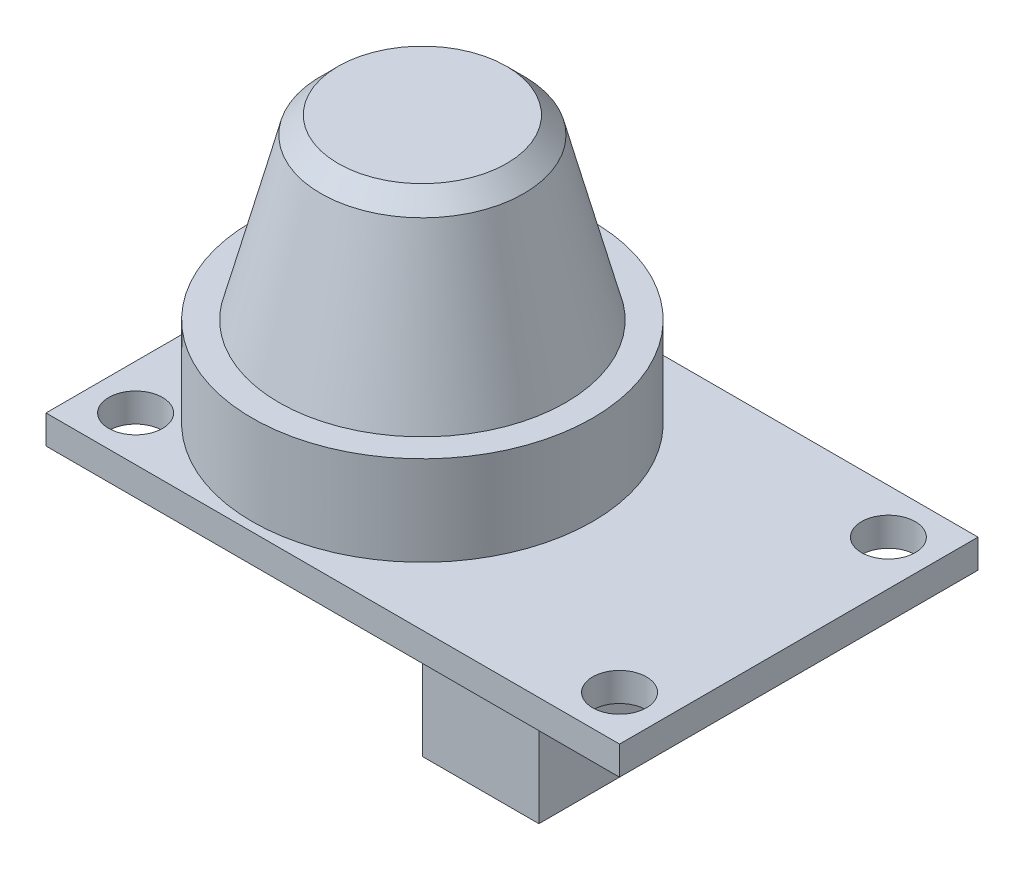
ISO-10303-21;
HEADER;
FILE_DESCRIPTION(('STEP AP214'),'2;1');
FILE_NAME('part.step','',(''),(''),'','','');
FILE_SCHEMA(('AUTOMOTIVE_DESIGN { 1 0 10303 214 1 1 1 1 }'));
ENDSEC;
DATA;
#1=APPLICATION_CONTEXT('core data for automotive mechanical design processes');
#2=APPLICATION_PROTOCOL_DEFINITION('international standard','automotive_design',2000,#1);
#3=PRODUCT_CONTEXT('',#1,'mechanical');
#4=PRODUCT('Part','Part','',(#3));
#5=PRODUCT_RELATED_PRODUCT_CATEGORY('part','',(#4));
#6=PRODUCT_DEFINITION_FORMATION('','',#4);
#7=PRODUCT_DEFINITION_CONTEXT('part definition',#1,'design');
#8=PRODUCT_DEFINITION('design','',#6,#7);
#9=PRODUCT_DEFINITION_SHAPE('','',#8);
#10=(LENGTH_UNIT() NAMED_UNIT(*) SI_UNIT(.MILLI.,.METRE.));
#11=(NAMED_UNIT(*) PLANE_ANGLE_UNIT() SI_UNIT($,.RADIAN.));
#12=(NAMED_UNIT(*) SI_UNIT($,.STERADIAN.) SOLID_ANGLE_UNIT());
#13=UNCERTAINTY_MEASURE_WITH_UNIT(LENGTH_MEASURE(1.E-05),#10,'distance_accuracy_value','');
#14=(GEOMETRIC_REPRESENTATION_CONTEXT(3) GLOBAL_UNCERTAINTY_ASSIGNED_CONTEXT((#13)) GLOBAL_UNIT_ASSIGNED_CONTEXT((#10,
#11,#12)) REPRESENTATION_CONTEXT('',''));
#15=CARTESIAN_POINT('',(0.,0.,0.));
#16=DIRECTION('',(0.,0.,1.));
#17=DIRECTION('',(1.,0.,0.));
#18=AXIS2_PLACEMENT_3D('',#15,#16,#17);
#19=CARTESIAN_POINT('',(0.,0.,0.));
#20=DIRECTION('',(0.,1.,0.));
#21=DIRECTION('',(0.,0.,1.));
#22=AXIS2_PLACEMENT_3D('',#19,#20,#21);
#23=PLANE('',#22);
#24=CARTESIAN_POINT('',(13.5,0.,7.5));
#25=DIRECTION('',(0.,1.,0.));
#26=DIRECTION('',(0.,0.,1.));
#27=AXIS2_PLACEMENT_3D('',#24,#25,#26);
#28=CIRCLE('',#27,1.5);
#29=CARTESIAN_POINT('',(13.5,0.,9.));
#30=VERTEX_POINT('',#29);
#31=EDGE_CURVE('E132',#30,#30,#28,.T.);
#32=ORIENTED_EDGE('',*,*,#31,.T.);
#33=EDGE_LOOP('',(#32));
#34=FACE_BOUND('',#33,.T.);
#35=CARTESIAN_POINT('',(-13.5,0.,7.5));
#36=DIRECTION('',(0.,1.,0.));
#37=DIRECTION('',(0.,0.,1.));
#38=AXIS2_PLACEMENT_3D('',#35,#36,#37);
#39=CIRCLE('',#38,1.5);
#40=CARTESIAN_POINT('',(-13.5,0.,9.));
#41=VERTEX_POINT('',#40);
#42=EDGE_CURVE('E145',#41,#41,#39,.T.);
#43=ORIENTED_EDGE('',*,*,#42,.T.);
#44=EDGE_LOOP('',(#43));
#45=FACE_BOUND('',#44,.T.);
#46=CARTESIAN_POINT('',(13.5,0.,-7.5));
#47=DIRECTION('',(0.,1.,0.));
#48=DIRECTION('',(0.,0.,1.));
#49=AXIS2_PLACEMENT_3D('',#46,#47,#48);
#50=CIRCLE('',#49,1.5);
#51=CARTESIAN_POINT('',(13.5,0.,-6.));
#52=VERTEX_POINT('',#51);
#53=EDGE_CURVE('E151',#52,#52,#50,.T.);
#54=ORIENTED_EDGE('',*,*,#53,.T.);
#55=EDGE_LOOP('',(#54));
#56=FACE_BOUND('',#55,.T.);
#57=CARTESIAN_POINT('',(-13.5,0.,-7.5));
#58=DIRECTION('',(0.,1.,0.));
#59=DIRECTION('',(0.,0.,1.));
#60=AXIS2_PLACEMENT_3D('',#57,#58,#59);
#61=CIRCLE('',#60,1.5);
#62=CARTESIAN_POINT('',(-13.5,0.,-6.));
#63=VERTEX_POINT('',#62);
#64=EDGE_CURVE('E159',#63,#63,#61,.T.);
#65=ORIENTED_EDGE('',*,*,#64,.T.);
#66=EDGE_LOOP('',(#65));
#67=FACE_BOUND('',#66,.T.);
#68=DIRECTION('',(0.,0.,-1.));
#69=VECTOR('',#68,1.);
#70=CARTESIAN_POINT('',(16.,0.,-10.));
#71=LINE('',#70,#69);
#72=CARTESIAN_POINT('',(16.,0.,10.));
#73=VERTEX_POINT('',#72);
#74=CARTESIAN_POINT('',(16.,0.,-10.));
#75=VERTEX_POINT('',#74);
#76=EDGE_CURVE('E167',#73,#75,#71,.T.);
#77=ORIENTED_EDGE('',*,*,#76,.F.);
#78=DIRECTION('',(1.,0.,0.));
#79=VECTOR('',#78,1.);
#80=CARTESIAN_POINT('',(-16.,0.,10.));
#81=LINE('',#80,#79);
#82=CARTESIAN_POINT('',(-16.,0.,10.));
#83=VERTEX_POINT('',#82);
#84=EDGE_CURVE('E176',#83,#73,#81,.T.);
#85=ORIENTED_EDGE('',*,*,#84,.F.);
#86=DIRECTION('',(0.,0.,1.));
#87=VECTOR('',#86,1.);
#88=CARTESIAN_POINT('',(-16.,0.,-10.));
#89=LINE('',#88,#87);
#90=CARTESIAN_POINT('',(-16.,0.,-10.));
#91=VERTEX_POINT('',#90);
#92=EDGE_CURVE('E192',#91,#83,#89,.T.);
#93=ORIENTED_EDGE('',*,*,#92,.F.);
#94=DIRECTION('',(-1.,0.,0.));
#95=VECTOR('',#94,1.);
#96=CARTESIAN_POINT('',(-16.,0.,-10.));
#97=LINE('',#96,#95);
#98=EDGE_CURVE('E189',#75,#91,#97,.T.);
#99=ORIENTED_EDGE('',*,*,#98,.F.);
#100=EDGE_LOOP('',(#77,#85,#93,#99));
#101=FACE_BOUND('',#100,.T.);
#102=DIRECTION('',(0.,0.,1.));
#103=VECTOR('',#102,1.);
#104=CARTESIAN_POINT('',(11.,0.,0.));
#105=LINE('',#104,#103);
#106=CARTESIAN_POINT('',(11.,0.,3.));
#107=VERTEX_POINT('',#106);
#108=CARTESIAN_POINT('',(11.,0.,9.5));
#109=VERTEX_POINT('',#108);
#110=EDGE_CURVE('E130',#107,#109,#105,.T.);
#111=ORIENTED_EDGE('',*,*,#110,.F.);
#112=DIRECTION('',(1.,0.,0.));
#113=VECTOR('',#112,1.);
#114=CARTESIAN_POINT('',(0.,0.,3.));
#115=LINE('',#114,#113);
#116=CARTESIAN_POINT('',(4.5,0.,3.));
#117=VERTEX_POINT('',#116);
#118=EDGE_CURVE('E127',#117,#107,#115,.T.);
#119=ORIENTED_EDGE('',*,*,#118,.F.);
#120=DIRECTION('',(0.,0.,-1.));
#121=VECTOR('',#120,1.);
#122=CARTESIAN_POINT('',(4.5,0.,0.));
#123=LINE('',#122,#121);
#124=CARTESIAN_POINT('',(4.5,0.,9.5));
#125=VERTEX_POINT('',#124);
#126=EDGE_CURVE('E63',#125,#117,#123,.T.);
#127=ORIENTED_EDGE('',*,*,#126,.F.);
#128=DIRECTION('',(-1.,0.,0.));
#129=VECTOR('',#128,1.);
#130=CARTESIAN_POINT('',(0.,0.,9.5));
#131=LINE('',#130,#129);
#132=EDGE_CURVE('E58',#109,#125,#131,.T.);
#133=ORIENTED_EDGE('',*,*,#132,.F.);
#134=EDGE_LOOP('',(#111,#119,#127,#133));
#135=FACE_BOUND('',#134,.T.);
#136=ADVANCED_FACE('F41',(#34,#45,#56,#67,#101,#135),#23,.F.);
#137=CARTESIAN_POINT('',(0.,1.6,0.));
#138=DIRECTION('',(0.,1.,0.));
#139=DIRECTION('',(0.,0.,1.));
#140=AXIS2_PLACEMENT_3D('',#137,#138,#139);
#141=PLANE('',#140);
#142=CARTESIAN_POINT('',(-5.,1.6,0.));
#143=DIRECTION('',(0.,1.,0.));
#144=DIRECTION('',(0.,0.,1.));
#145=AXIS2_PLACEMENT_3D('',#142,#143,#144);
#146=CIRCLE('',#145,9.5);
#147=CARTESIAN_POINT('',(-5.,1.6,9.5));
#148=VERTEX_POINT('',#147);
#149=EDGE_CURVE('E45',#148,#148,#146,.F.);
#150=ORIENTED_EDGE('',*,*,#149,.T.);
#151=EDGE_LOOP('',(#150));
#152=FACE_BOUND('',#151,.T.);
#153=CARTESIAN_POINT('',(-13.5,1.6,7.5));
#154=DIRECTION('',(0.,1.,0.));
#155=DIRECTION('',(0.,0.,1.));
#156=AXIS2_PLACEMENT_3D('',#153,#154,#155);
#157=CIRCLE('',#156,1.5);
#158=CARTESIAN_POINT('',(-13.5,1.6,9.));
#159=VERTEX_POINT('',#158);
#160=EDGE_CURVE('E147',#159,#159,#157,.T.);
#161=ORIENTED_EDGE('',*,*,#160,.F.);
#162=EDGE_LOOP('',(#161));
#163=FACE_BOUND('',#162,.T.);
#164=CARTESIAN_POINT('',(-13.5,1.6,-7.5));
#165=DIRECTION('',(0.,1.,0.));
#166=DIRECTION('',(0.,0.,1.));
#167=AXIS2_PLACEMENT_3D('',#164,#165,#166);
#168=CIRCLE('',#167,1.5);
#169=CARTESIAN_POINT('',(-13.5,1.6,-6.));
#170=VERTEX_POINT('',#169);
#171=EDGE_CURVE('E163',#170,#170,#168,.T.);
#172=ORIENTED_EDGE('',*,*,#171,.F.);
#173=EDGE_LOOP('',(#172));
#174=FACE_BOUND('',#173,.T.);
#175=DIRECTION('',(0.,0.,-1.));
#176=VECTOR('',#175,1.);
#177=CARTESIAN_POINT('',(16.,1.6,-10.));
#178=LINE('',#177,#176);
#179=CARTESIAN_POINT('',(16.,1.6,10.));
#180=VERTEX_POINT('',#179);
#181=CARTESIAN_POINT('',(16.,1.6,-10.));
#182=VERTEX_POINT('',#181);
#183=EDGE_CURVE('E171',#180,#182,#178,.T.);
#184=ORIENTED_EDGE('',*,*,#183,.T.);
#185=DIRECTION('',(-1.,0.,0.));
#186=VECTOR('',#185,1.);
#187=CARTESIAN_POINT('',(-16.,1.6,-10.));
#188=LINE('',#187,#186);
#189=CARTESIAN_POINT('',(-16.,1.6,-10.));
#190=VERTEX_POINT('',#189);
#191=EDGE_CURVE('E175',#182,#190,#188,.T.);
#192=ORIENTED_EDGE('',*,*,#191,.T.);
#193=DIRECTION('',(0.,0.,1.));
#194=VECTOR('',#193,1.);
#195=CARTESIAN_POINT('',(-16.,1.6,-10.));
#196=LINE('',#195,#194);
#197=CARTESIAN_POINT('',(-16.,1.6,10.));
#198=VERTEX_POINT('',#197);
#199=EDGE_CURVE('E179',#190,#198,#196,.T.);
#200=ORIENTED_EDGE('',*,*,#199,.T.);
#201=DIRECTION('',(1.,0.,0.));
#202=VECTOR('',#201,1.);
#203=CARTESIAN_POINT('',(-16.,1.6,10.));
#204=LINE('',#203,#202);
#205=EDGE_CURVE('E182',#198,#180,#204,.T.);
#206=ORIENTED_EDGE('',*,*,#205,.T.);
#207=EDGE_LOOP('',(#184,#192,#200,#206));
#208=FACE_BOUND('',#207,.T.);
#209=CARTESIAN_POINT('',(13.5,1.6,-7.5));
#210=DIRECTION('',(0.,1.,0.));
#211=DIRECTION('',(0.,0.,1.));
#212=AXIS2_PLACEMENT_3D('',#209,#210,#211);
#213=CIRCLE('',#212,1.5);
#214=CARTESIAN_POINT('',(13.5,1.6,-6.));
#215=VERTEX_POINT('',#214);
#216=EDGE_CURVE('E155',#215,#215,#213,.T.);
#217=ORIENTED_EDGE('',*,*,#216,.F.);
#218=EDGE_LOOP('',(#217));
#219=FACE_BOUND('',#218,.T.);
#220=CARTESIAN_POINT('',(13.5,1.6,7.5));
#221=DIRECTION('',(0.,1.,0.));
#222=DIRECTION('',(0.,0.,1.));
#223=AXIS2_PLACEMENT_3D('',#220,#221,#222);
#224=CIRCLE('',#223,1.5);
#225=CARTESIAN_POINT('',(13.5,1.6,9.));
#226=VERTEX_POINT('',#225);
#227=EDGE_CURVE('E137',#226,#226,#224,.T.);
#228=ORIENTED_EDGE('',*,*,#227,.F.);
#229=EDGE_LOOP('',(#228));
#230=FACE_BOUND('',#229,.T.);
#231=ADVANCED_FACE('F224',(#152,#163,#174,#208,#219,#230),#141,.T.);
#232=CARTESIAN_POINT('',(16.,1.6,-10.));
#233=DIRECTION('',(-1.,0.,0.));
#234=DIRECTION('',(0.,0.,1.));
#235=AXIS2_PLACEMENT_3D('',#232,#233,#234);
#236=PLANE('',#235);
#237=ORIENTED_EDGE('',*,*,#76,.T.);
#238=DIRECTION('',(0.,-1.,0.));
#239=VECTOR('',#238,1.);
#240=CARTESIAN_POINT('',(16.,1.6,-10.));
#241=LINE('',#240,#239);
#242=EDGE_CURVE('E11',#182,#75,#241,.T.);
#243=ORIENTED_EDGE('',*,*,#242,.F.);
#244=ORIENTED_EDGE('',*,*,#183,.F.);
#245=DIRECTION('',(0.,-1.,0.));
#246=VECTOR('',#245,1.);
#247=CARTESIAN_POINT('',(16.,1.6,10.));
#248=LINE('',#247,#246);
#249=EDGE_CURVE('E185',#180,#73,#248,.T.);
#250=ORIENTED_EDGE('',*,*,#249,.T.);
#251=EDGE_LOOP('',(#237,#243,#244,#250));
#252=FACE_BOUND('',#251,.T.);
#253=ADVANCED_FACE('F43',(#252),#236,.F.);
#254=CARTESIAN_POINT('',(-16.,1.6,-10.));
#255=DIRECTION('',(0.,0.,1.));
#256=DIRECTION('',(1.,0.,0.));
#257=AXIS2_PLACEMENT_3D('',#254,#255,#256);
#258=PLANE('',#257);
#259=ORIENTED_EDGE('',*,*,#98,.T.);
#260=DIRECTION('',(0.,-1.,0.));
#261=VECTOR('',#260,1.);
#262=CARTESIAN_POINT('',(-16.,1.6,-10.));
#263=LINE('',#262,#261);
#264=EDGE_CURVE('E51',#190,#91,#263,.T.);
#265=ORIENTED_EDGE('',*,*,#264,.F.);
#266=ORIENTED_EDGE('',*,*,#191,.F.);
#267=ORIENTED_EDGE('',*,*,#242,.T.);
#268=EDGE_LOOP('',(#259,#265,#266,#267));
#269=FACE_BOUND('',#268,.T.);
#270=ADVANCED_FACE('F226',(#269),#258,.F.);
#271=CARTESIAN_POINT('',(-16.,1.6,-10.));
#272=DIRECTION('',(1.,0.,0.));
#273=DIRECTION('',(0.,0.,-1.));
#274=AXIS2_PLACEMENT_3D('',#271,#272,#273);
#275=PLANE('',#274);
#276=ORIENTED_EDGE('',*,*,#92,.T.);
#277=DIRECTION('',(0.,-1.,0.));
#278=VECTOR('',#277,1.);
#279=CARTESIAN_POINT('',(-16.,1.6,10.));
#280=LINE('',#279,#278);
#281=EDGE_CURVE('E200',#198,#83,#280,.T.);
#282=ORIENTED_EDGE('',*,*,#281,.F.);
#283=ORIENTED_EDGE('',*,*,#199,.F.);
#284=ORIENTED_EDGE('',*,*,#264,.T.);
#285=EDGE_LOOP('',(#276,#282,#283,#284));
#286=FACE_BOUND('',#285,.T.);
#287=ADVANCED_FACE('F210',(#286),#275,.F.);
#288=CARTESIAN_POINT('',(-16.,1.6,10.));
#289=DIRECTION('',(0.,0.,-1.));
#290=DIRECTION('',(-1.,0.,0.));
#291=AXIS2_PLACEMENT_3D('',#288,#289,#290);
#292=PLANE('',#291);
#293=ORIENTED_EDGE('',*,*,#84,.T.);
#294=ORIENTED_EDGE('',*,*,#249,.F.);
#295=ORIENTED_EDGE('',*,*,#205,.F.);
#296=ORIENTED_EDGE('',*,*,#281,.T.);
#297=EDGE_LOOP('',(#293,#294,#295,#296));
#298=FACE_BOUND('',#297,.T.);
#299=ADVANCED_FACE('F218',(#298),#292,.F.);
#300=CARTESIAN_POINT('',(-13.5,1.6,-7.5));
#301=DIRECTION('',(0.,-1.,0.));
#302=DIRECTION('',(0.,0.,-1.));
#303=AXIS2_PLACEMENT_3D('',#300,#301,#302);
#304=CYLINDRICAL_SURFACE('',#303,1.5);
#305=ORIENTED_EDGE('',*,*,#171,.T.);
#306=EDGE_LOOP('',(#305));
#307=FACE_BOUND('',#306,.T.);
#308=ORIENTED_EDGE('',*,*,#64,.F.);
#309=EDGE_LOOP('',(#308));
#310=FACE_BOUND('',#309,.T.);
#311=ADVANCED_FACE('F245',(#307,#310),#304,.F.);
#312=CARTESIAN_POINT('',(13.5,1.6,-7.5));
#313=DIRECTION('',(0.,-1.,0.));
#314=DIRECTION('',(0.,0.,-1.));
#315=AXIS2_PLACEMENT_3D('',#312,#313,#314);
#316=CYLINDRICAL_SURFACE('',#315,1.5);
#317=ORIENTED_EDGE('',*,*,#216,.T.);
#318=EDGE_LOOP('',(#317));
#319=FACE_BOUND('',#318,.T.);
#320=ORIENTED_EDGE('',*,*,#53,.F.);
#321=EDGE_LOOP('',(#320));
#322=FACE_BOUND('',#321,.T.);
#323=ADVANCED_FACE('F249',(#319,#322),#316,.F.);
#324=CARTESIAN_POINT('',(-13.5,1.6,7.5));
#325=DIRECTION('',(0.,-1.,0.));
#326=DIRECTION('',(0.,0.,-1.));
#327=AXIS2_PLACEMENT_3D('',#324,#325,#326);
#328=CYLINDRICAL_SURFACE('',#327,1.5);
#329=ORIENTED_EDGE('',*,*,#160,.T.);
#330=EDGE_LOOP('',(#329));
#331=FACE_BOUND('',#330,.T.);
#332=ORIENTED_EDGE('',*,*,#42,.F.);
#333=EDGE_LOOP('',(#332));
#334=FACE_BOUND('',#333,.T.);
#335=ADVANCED_FACE('F254',(#331,#334),#328,.F.);
#336=CARTESIAN_POINT('',(13.5,1.6,7.5));
#337=DIRECTION('',(0.,-1.,0.));
#338=DIRECTION('',(0.,0.,-1.));
#339=AXIS2_PLACEMENT_3D('',#336,#337,#338);
#340=CYLINDRICAL_SURFACE('',#339,1.5);
#341=ORIENTED_EDGE('',*,*,#227,.T.);
#342=EDGE_LOOP('',(#341));
#343=FACE_BOUND('',#342,.T.);
#344=ORIENTED_EDGE('',*,*,#31,.F.);
#345=EDGE_LOOP('',(#344));
#346=FACE_BOUND('',#345,.T.);
#347=ADVANCED_FACE('F261',(#343,#346),#340,.F.);
#348=CARTESIAN_POINT('',(11.,-5.,0.));
#349=DIRECTION('',(-1.,0.,0.));
#350=DIRECTION('',(0.,0.,1.));
#351=AXIS2_PLACEMENT_3D('',#348,#349,#350);
#352=PLANE('',#351);
#353=ORIENTED_EDGE('',*,*,#110,.T.);
#354=DIRECTION('',(0.,1.,0.));
#355=VECTOR('',#354,1.);
#356=CARTESIAN_POINT('',(11.,-5.,9.5));
#357=LINE('',#356,#355);
#358=CARTESIAN_POINT('',(11.,-5.,9.5));
#359=VERTEX_POINT('',#358);
#360=EDGE_CURVE('E109',#359,#109,#357,.T.);
#361=ORIENTED_EDGE('',*,*,#360,.F.);
#362=DIRECTION('',(0.,0.,1.));
#363=VECTOR('',#362,1.);
#364=CARTESIAN_POINT('',(11.,-5.,0.));
#365=LINE('',#364,#363);
#366=CARTESIAN_POINT('',(11.,-5.,3.));
#367=VERTEX_POINT('',#366);
#368=EDGE_CURVE('E117',#367,#359,#365,.T.);
#369=ORIENTED_EDGE('',*,*,#368,.F.);
#370=DIRECTION('',(0.,1.,0.));
#371=VECTOR('',#370,1.);
#372=CARTESIAN_POINT('',(11.,-5.,3.));
#373=LINE('',#372,#371);
#374=EDGE_CURVE('E325',#367,#107,#373,.T.);
#375=ORIENTED_EDGE('',*,*,#374,.T.);
#376=EDGE_LOOP('',(#353,#361,#369,#375));
#377=FACE_BOUND('',#376,.T.);
#378=ADVANCED_FACE('F129',(#377),#352,.F.);
#379=CARTESIAN_POINT('',(0.,-5.,9.5));
#380=DIRECTION('',(0.,0.,-1.));
#381=DIRECTION('',(-1.,0.,0.));
#382=AXIS2_PLACEMENT_3D('',#379,#380,#381);
#383=PLANE('',#382);
#384=ORIENTED_EDGE('',*,*,#132,.T.);
#385=DIRECTION('',(0.,1.,0.));
#386=VECTOR('',#385,1.);
#387=CARTESIAN_POINT('',(4.5,-5.,9.5));
#388=LINE('',#387,#386);
#389=CARTESIAN_POINT('',(4.5,-5.,9.5));
#390=VERTEX_POINT('',#389);
#391=EDGE_CURVE('E112',#390,#125,#388,.T.);
#392=ORIENTED_EDGE('',*,*,#391,.F.);
#393=DIRECTION('',(-1.,0.,0.));
#394=VECTOR('',#393,1.);
#395=CARTESIAN_POINT('',(0.,-5.,9.5));
#396=LINE('',#395,#394);
#397=EDGE_CURVE('E105',#359,#390,#396,.T.);
#398=ORIENTED_EDGE('',*,*,#397,.F.);
#399=ORIENTED_EDGE('',*,*,#360,.T.);
#400=EDGE_LOOP('',(#384,#392,#398,#399));
#401=FACE_BOUND('',#400,.T.);
#402=ADVANCED_FACE('F107',(#401),#383,.F.);
#403=CARTESIAN_POINT('',(4.5,-5.,0.));
#404=DIRECTION('',(1.,0.,0.));
#405=DIRECTION('',(0.,0.,-1.));
#406=AXIS2_PLACEMENT_3D('',#403,#404,#405);
#407=PLANE('',#406);
#408=ORIENTED_EDGE('',*,*,#126,.T.);
#409=DIRECTION('',(0.,1.,0.));
#410=VECTOR('',#409,1.);
#411=CARTESIAN_POINT('',(4.5,-5.,3.));
#412=LINE('',#411,#410);
#413=CARTESIAN_POINT('',(4.5,-5.,3.));
#414=VERTEX_POINT('',#413);
#415=EDGE_CURVE('E139',#414,#117,#412,.T.);
#416=ORIENTED_EDGE('',*,*,#415,.F.);
#417=DIRECTION('',(0.,0.,-1.));
#418=VECTOR('',#417,1.);
#419=CARTESIAN_POINT('',(4.5,-5.,0.));
#420=LINE('',#419,#418);
#421=EDGE_CURVE('E116',#390,#414,#420,.T.);
#422=ORIENTED_EDGE('',*,*,#421,.F.);
#423=ORIENTED_EDGE('',*,*,#391,.T.);
#424=EDGE_LOOP('',(#408,#416,#422,#423));
#425=FACE_BOUND('',#424,.T.);
#426=ADVANCED_FACE('F270',(#425),#407,.F.);
#427=CARTESIAN_POINT('',(0.,-5.,3.));
#428=DIRECTION('',(0.,0.,1.));
#429=DIRECTION('',(1.,0.,0.));
#430=AXIS2_PLACEMENT_3D('',#427,#428,#429);
#431=PLANE('',#430);
#432=ORIENTED_EDGE('',*,*,#118,.T.);
#433=ORIENTED_EDGE('',*,*,#374,.F.);
#434=DIRECTION('',(1.,0.,0.));
#435=VECTOR('',#434,1.);
#436=CARTESIAN_POINT('',(0.,-5.,3.));
#437=LINE('',#436,#435);
#438=EDGE_CURVE('E122',#414,#367,#437,.T.);
#439=ORIENTED_EDGE('',*,*,#438,.F.);
#440=ORIENTED_EDGE('',*,*,#415,.T.);
#441=EDGE_LOOP('',(#432,#433,#439,#440));
#442=FACE_BOUND('',#441,.T.);
#443=ADVANCED_FACE('F273',(#442),#431,.F.);
#444=CARTESIAN_POINT('',(0.,-5.,0.));
#445=DIRECTION('',(0.,-1.,0.));
#446=DIRECTION('',(0.,0.,-1.));
#447=AXIS2_PLACEMENT_3D('',#444,#445,#446);
#448=PLANE('',#447);
#449=ORIENTED_EDGE('',*,*,#368,.T.);
#450=ORIENTED_EDGE('',*,*,#397,.T.);
#451=ORIENTED_EDGE('',*,*,#421,.T.);
#452=ORIENTED_EDGE('',*,*,#438,.T.);
#453=EDGE_LOOP('',(#449,#450,#451,#452));
#454=FACE_BOUND('',#453,.T.);
#455=ADVANCED_FACE('F120',(#454),#448,.T.);
#456=CARTESIAN_POINT('',(-5.,16.5,0.));
#457=DIRECTION('',(0.,-1.,0.));
#458=DIRECTION('',(0.,0.,-1.));
#459=AXIS2_PLACEMENT_3D('',#456,#457,#458);
#460=CYLINDRICAL_SURFACE('',#459,9.5);
#461=CARTESIAN_POINT('',(-4.99999999999997,6.60000000000005,0.));
#462=DIRECTION('',(0.,-1.,0.));
#463=DIRECTION('',(1.,0.,0.));
#464=AXIS2_PLACEMENT_3D('',#461,#462,#463);
#465=CIRCLE('',#464,9.49999999999997);
#466=CARTESIAN_POINT('',(4.5,6.60000000000008,0.));
#467=VERTEX_POINT('',#466);
#468=EDGE_CURVE('E304',#467,#467,#465,.T.);
#469=ORIENTED_EDGE('',*,*,#468,.T.);
#470=EDGE_LOOP('',(#469));
#471=FACE_BOUND('',#470,.T.);
#472=ORIENTED_EDGE('',*,*,#149,.F.);
#473=EDGE_LOOP('',(#472));
#474=FACE_BOUND('',#473,.T.);
#475=ADVANCED_FACE('F280',(#471,#474),#460,.T.);
#476=CARTESIAN_POINT('',(-5.,15.5333333333334,0.));
#477=DIRECTION('',(0.,-1.,0.));
#478=DIRECTION('',(1.,0.,0.));
#479=AXIS2_PLACEMENT_3D('',#476,#477,#478);
#480=CONICAL_SURFACE('',#479,5.66666666666666,0.7853981633975);
#481=CARTESIAN_POINT('',(-5.,16.5,0.));
#482=DIRECTION('',(0.,-1.,0.));
#483=DIRECTION('',(1.,0.,0.));
#484=AXIS2_PLACEMENT_3D('',#481,#482,#483);
#485=CIRCLE('',#484,4.7);
#486=CARTESIAN_POINT('',(-0.300000000000005,16.5,0.));
#487=VERTEX_POINT('',#486);
#488=EDGE_CURVE('E314',#487,#487,#485,.T.);
#489=ORIENTED_EDGE('',*,*,#488,.T.);
#490=EDGE_LOOP('',(#489));
#491=FACE_BOUND('',#490,.T.);
#492=CARTESIAN_POINT('',(-5.,15.5333333333334,0.));
#493=DIRECTION('',(0.,-1.,0.));
#494=DIRECTION('',(1.,0.,0.));
#495=AXIS2_PLACEMENT_3D('',#492,#493,#494);
#496=CIRCLE('',#495,5.66666666666666);
#497=CARTESIAN_POINT('',(0.666666666666658,15.5333333333334,0.));
#498=VERTEX_POINT('',#497);
#499=EDGE_CURVE('E309',#498,#498,#496,.T.);
#500=ORIENTED_EDGE('',*,*,#499,.F.);
#501=EDGE_LOOP('',(#500));
#502=FACE_BOUND('',#501,.T.);
#503=ADVANCED_FACE('F283',(#491,#502),#480,.T.);
#504=CARTESIAN_POINT('',(-5.,15.5333333333334,0.));
#505=DIRECTION('',(0.,-1.,0.));
#506=DIRECTION('',(1.,0.,0.));
#507=AXIS2_PLACEMENT_3D('',#504,#505,#506);
#508=CONICAL_SURFACE('',#507,5.66666666666666,0.255486157318641);
#509=CARTESIAN_POINT('',(-4.99999999999997,6.60000000000005,0.));
#510=DIRECTION('',(0.,-1.,0.));
#511=DIRECTION('',(1.,0.,0.));
#512=AXIS2_PLACEMENT_3D('',#509,#510,#511);
#513=CIRCLE('',#512,7.99999999999997);
#514=CARTESIAN_POINT('',(2.99999999999999,6.60000000000008,0.));
#515=VERTEX_POINT('',#514);
#516=EDGE_CURVE('E307',#515,#515,#513,.T.);
#517=ORIENTED_EDGE('',*,*,#516,.F.);
#518=EDGE_LOOP('',(#517));
#519=FACE_BOUND('',#518,.T.);
#520=ORIENTED_EDGE('',*,*,#499,.T.);
#521=EDGE_LOOP('',(#520));
#522=FACE_BOUND('',#521,.T.);
#523=ADVANCED_FACE('F292',(#519,#522),#508,.T.);
#524=CARTESIAN_POINT('',(0.,6.59999999999999,0.));
#525=DIRECTION('',(0.,-1.,0.));
#526=DIRECTION('',(1.,0.,0.));
#527=AXIS2_PLACEMENT_3D('',#524,#525,#526);
#528=PLANE('',#527);
#529=ORIENTED_EDGE('',*,*,#468,.F.);
#530=EDGE_LOOP('',(#529));
#531=FACE_BOUND('',#530,.T.);
#532=ORIENTED_EDGE('',*,*,#516,.T.);
#533=EDGE_LOOP('',(#532));
#534=FACE_BOUND('',#533,.T.);
#535=ADVANCED_FACE('F288',(#531,#534),#528,.F.);
#536=CARTESIAN_POINT('',(-5.,16.5,0.));
#537=DIRECTION('',(0.,1.,0.));
#538=DIRECTION('',(0.,0.,1.));
#539=AXIS2_PLACEMENT_3D('',#536,#537,#538);
#540=PLANE('',#539);
#541=ORIENTED_EDGE('',*,*,#488,.F.);
#542=EDGE_LOOP('',(#541));
#543=FACE_BOUND('',#542,.T.);
#544=ADVANCED_FACE('F285',(#543),#540,.T.);
#545=CLOSED_SHELL('',(#136,#231,#253,#270,#287,#299,#311,#323,#335,#347,#378,#402,#426,#443,
#455,#475,#503,#523,#535,#544));
#546=MANIFOLD_SOLID_BREP('B2',#545);
#547=ADVANCED_BREP_SHAPE_REPRESENTATION('',(#18,#546),#14);
#548=SHAPE_DEFINITION_REPRESENTATION(#9,#547);
ENDSEC;
END-ISO-10303-21;
